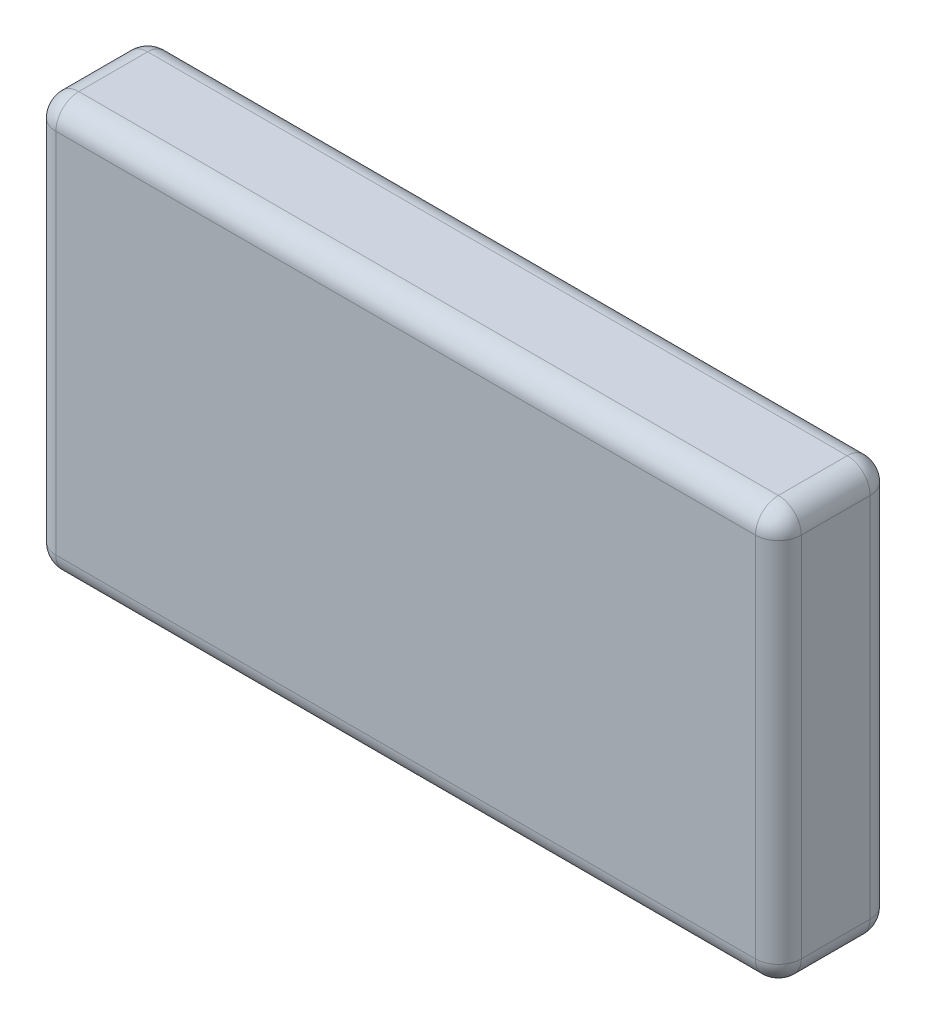
ISO-10303-21;
HEADER;
FILE_DESCRIPTION(('STEP AP214'),'2;1');
FILE_NAME('part.step','',(''),(''),'','','');
FILE_SCHEMA(('AUTOMOTIVE_DESIGN { 1 0 10303 214 1 1 1 1 }'));
ENDSEC;
DATA;
#1=APPLICATION_CONTEXT('core data for automotive mechanical design processes');
#2=APPLICATION_PROTOCOL_DEFINITION('international standard','automotive_design',2000,#1);
#3=PRODUCT_CONTEXT('',#1,'mechanical');
#4=PRODUCT('Part','Part','',(#3));
#5=PRODUCT_RELATED_PRODUCT_CATEGORY('part','',(#4));
#6=PRODUCT_DEFINITION_FORMATION('','',#4);
#7=PRODUCT_DEFINITION_CONTEXT('part definition',#1,'design');
#8=PRODUCT_DEFINITION('design','',#6,#7);
#9=PRODUCT_DEFINITION_SHAPE('','',#8);
#10=(LENGTH_UNIT() NAMED_UNIT(*) SI_UNIT(.MILLI.,.METRE.));
#11=(NAMED_UNIT(*) PLANE_ANGLE_UNIT() SI_UNIT($,.RADIAN.));
#12=(NAMED_UNIT(*) SI_UNIT($,.STERADIAN.) SOLID_ANGLE_UNIT());
#13=UNCERTAINTY_MEASURE_WITH_UNIT(LENGTH_MEASURE(1.E-05),#10,'distance_accuracy_value','');
#14=(GEOMETRIC_REPRESENTATION_CONTEXT(3) GLOBAL_UNCERTAINTY_ASSIGNED_CONTEXT((#13)) GLOBAL_UNIT_ASSIGNED_CONTEXT((#10,
#11,#12)) REPRESENTATION_CONTEXT('',''));
#15=CARTESIAN_POINT('',(0.,0.,0.));
#16=DIRECTION('',(0.,0.,1.));
#17=DIRECTION('',(1.,0.,0.));
#18=AXIS2_PLACEMENT_3D('',#15,#16,#17);
#19=CARTESIAN_POINT('',(0.,0.,10.));
#20=DIRECTION('',(1.,0.,0.));
#21=DIRECTION('',(0.,1.,0.));
#22=AXIS2_PLACEMENT_3D('',#19,#20,#21);
#23=PLANE('',#22);
#24=DIRECTION('',(0.,0.,-1.));
#25=VECTOR('',#24,1.);
#26=CARTESIAN_POINT('',(0.,34.,10.));
#27=LINE('',#26,#25);
#28=CARTESIAN_POINT('',(0.,34.,8.));
#29=VERTEX_POINT('',#28);
#30=CARTESIAN_POINT('',(0.,34.,2.));
#31=VERTEX_POINT('',#30);
#32=EDGE_CURVE('E155',#29,#31,#27,.T.);
#33=ORIENTED_EDGE('',*,*,#32,.T.);
#34=DIRECTION('',(0.,-1.,0.));
#35=VECTOR('',#34,1.);
#36=CARTESIAN_POINT('',(0.,0.,2.));
#37=LINE('',#36,#35);
#38=CARTESIAN_POINT('',(0.,2.,2.));
#39=VERTEX_POINT('',#38);
#40=EDGE_CURVE('E206',#31,#39,#37,.T.);
#41=ORIENTED_EDGE('',*,*,#40,.T.);
#42=DIRECTION('',(0.,0.,-1.));
#43=VECTOR('',#42,1.);
#44=CARTESIAN_POINT('',(0.,2.,10.));
#45=LINE('',#44,#43);
#46=CARTESIAN_POINT('',(0.,2.,8.));
#47=VERTEX_POINT('',#46);
#48=EDGE_CURVE('E201',#39,#47,#45,.F.);
#49=ORIENTED_EDGE('',*,*,#48,.T.);
#50=DIRECTION('',(0.,-1.,0.));
#51=VECTOR('',#50,1.);
#52=CARTESIAN_POINT('',(0.,0.,8.));
#53=LINE('',#52,#51);
#54=EDGE_CURVE('E198',#47,#29,#53,.F.);
#55=ORIENTED_EDGE('',*,*,#54,.T.);
#56=EDGE_LOOP('',(#33,#41,#49,#55));
#57=FACE_BOUND('',#56,.T.);
#58=ADVANCED_FACE('F45',(#57),#23,.F.);
#59=CARTESIAN_POINT('',(0.,0.,10.));
#60=DIRECTION('',(0.,1.,0.));
#61=DIRECTION('',(0.,0.,1.));
#62=AXIS2_PLACEMENT_3D('',#59,#60,#61);
#63=PLANE('',#62);
#64=DIRECTION('',(0.,0.,-1.));
#65=VECTOR('',#64,1.);
#66=CARTESIAN_POINT('',(2.,0.,10.));
#67=LINE('',#66,#65);
#68=CARTESIAN_POINT('',(2.,0.,8.));
#69=VERTEX_POINT('',#68);
#70=CARTESIAN_POINT('',(2.,0.,2.));
#71=VERTEX_POINT('',#70);
#72=EDGE_CURVE('E215',#69,#71,#67,.T.);
#73=ORIENTED_EDGE('',*,*,#72,.T.);
#74=DIRECTION('',(1.,0.,0.));
#75=VECTOR('',#74,1.);
#76=CARTESIAN_POINT('',(65.,0.,2.));
#77=LINE('',#76,#75);
#78=CARTESIAN_POINT('',(63.,0.,2.));
#79=VERTEX_POINT('',#78);
#80=EDGE_CURVE('E219',#71,#79,#77,.T.);
#81=ORIENTED_EDGE('',*,*,#80,.T.);
#82=DIRECTION('',(0.,0.,-1.));
#83=VECTOR('',#82,1.);
#84=CARTESIAN_POINT('',(63.,0.,10.));
#85=LINE('',#84,#83);
#86=CARTESIAN_POINT('',(63.,0.,8.));
#87=VERTEX_POINT('',#86);
#88=EDGE_CURVE('E212',#79,#87,#85,.F.);
#89=ORIENTED_EDGE('',*,*,#88,.T.);
#90=DIRECTION('',(1.,0.,0.));
#91=VECTOR('',#90,1.);
#92=CARTESIAN_POINT('',(0.,0.,8.));
#93=LINE('',#92,#91);
#94=EDGE_CURVE('E209',#87,#69,#93,.F.);
#95=ORIENTED_EDGE('',*,*,#94,.T.);
#96=EDGE_LOOP('',(#73,#81,#89,#95));
#97=FACE_BOUND('',#96,.T.);
#98=ADVANCED_FACE('F353',(#97),#63,.F.);
#99=CARTESIAN_POINT('',(65.,0.,10.));
#100=DIRECTION('',(-1.,0.,0.));
#101=DIRECTION('',(0.,-1.,0.));
#102=AXIS2_PLACEMENT_3D('',#99,#100,#101);
#103=PLANE('',#102);
#104=DIRECTION('',(0.,0.,-1.));
#105=VECTOR('',#104,1.);
#106=CARTESIAN_POINT('',(65.,2.,10.));
#107=LINE('',#106,#105);
#108=CARTESIAN_POINT('',(65.,2.,8.));
#109=VERTEX_POINT('',#108);
#110=CARTESIAN_POINT('',(65.,2.,2.));
#111=VERTEX_POINT('',#110);
#112=EDGE_CURVE('E188',#109,#111,#107,.T.);
#113=ORIENTED_EDGE('',*,*,#112,.T.);
#114=DIRECTION('',(0.,1.,0.));
#115=VECTOR('',#114,1.);
#116=CARTESIAN_POINT('',(65.,36.,2.));
#117=LINE('',#116,#115);
#118=CARTESIAN_POINT('',(65.,34.,2.));
#119=VERTEX_POINT('',#118);
#120=EDGE_CURVE('E195',#111,#119,#117,.T.);
#121=ORIENTED_EDGE('',*,*,#120,.T.);
#122=DIRECTION('',(0.,0.,-1.));
#123=VECTOR('',#122,1.);
#124=CARTESIAN_POINT('',(65.,34.,10.));
#125=LINE('',#124,#123);
#126=CARTESIAN_POINT('',(65.,34.,8.));
#127=VERTEX_POINT('',#126);
#128=EDGE_CURVE('E191',#119,#127,#125,.F.);
#129=ORIENTED_EDGE('',*,*,#128,.T.);
#130=DIRECTION('',(0.,1.,0.));
#131=VECTOR('',#130,1.);
#132=CARTESIAN_POINT('',(65.,0.,8.));
#133=LINE('',#132,#131);
#134=EDGE_CURVE('E185',#127,#109,#133,.F.);
#135=ORIENTED_EDGE('',*,*,#134,.T.);
#136=EDGE_LOOP('',(#113,#121,#129,#135));
#137=FACE_BOUND('',#136,.T.);
#138=ADVANCED_FACE('F344',(#137),#103,.F.);
#139=CARTESIAN_POINT('',(0.,36.,10.));
#140=DIRECTION('',(0.,-1.,0.));
#141=DIRECTION('',(0.,0.,-1.));
#142=AXIS2_PLACEMENT_3D('',#139,#140,#141);
#143=PLANE('',#142);
#144=DIRECTION('',(0.,0.,-1.));
#145=VECTOR('',#144,1.);
#146=CARTESIAN_POINT('',(63.,36.,10.));
#147=LINE('',#146,#145);
#148=CARTESIAN_POINT('',(63.,36.,8.));
#149=VERTEX_POINT('',#148);
#150=CARTESIAN_POINT('',(63.,36.,2.));
#151=VERTEX_POINT('',#150);
#152=EDGE_CURVE('E147',#149,#151,#147,.T.);
#153=ORIENTED_EDGE('',*,*,#152,.T.);
#154=DIRECTION('',(-1.,0.,0.));
#155=VECTOR('',#154,1.);
#156=CARTESIAN_POINT('',(0.,36.,2.));
#157=LINE('',#156,#155);
#158=CARTESIAN_POINT('',(1.99999999999999,36.,2.));
#159=VERTEX_POINT('',#158);
#160=EDGE_CURVE('E142',#151,#159,#157,.T.);
#161=ORIENTED_EDGE('',*,*,#160,.T.);
#162=DIRECTION('',(0.,0.,-1.));
#163=VECTOR('',#162,1.);
#164=CARTESIAN_POINT('',(1.99999999999999,36.,10.));
#165=LINE('',#164,#163);
#166=CARTESIAN_POINT('',(1.99999999999999,36.,8.));
#167=VERTEX_POINT('',#166);
#168=EDGE_CURVE('E134',#159,#167,#165,.F.);
#169=ORIENTED_EDGE('',*,*,#168,.T.);
#170=DIRECTION('',(-1.,0.,0.));
#171=VECTOR('',#170,1.);
#172=CARTESIAN_POINT('',(0.,36.,8.));
#173=LINE('',#172,#171);
#174=EDGE_CURVE('E139',#167,#149,#173,.F.);
#175=ORIENTED_EDGE('',*,*,#174,.T.);
#176=EDGE_LOOP('',(#153,#161,#169,#175));
#177=FACE_BOUND('',#176,.T.);
#178=ADVANCED_FACE('F137',(#177),#143,.F.);
#179=CARTESIAN_POINT('',(0.,0.,10.));
#180=DIRECTION('',(0.,0.,-1.));
#181=DIRECTION('',(-1.,0.,0.));
#182=AXIS2_PLACEMENT_3D('',#179,#180,#181);
#183=PLANE('',#182);
#184=DIRECTION('',(0.,1.,0.));
#185=VECTOR('',#184,1.);
#186=CARTESIAN_POINT('',(63.,0.,10.));
#187=LINE('',#186,#185);
#188=CARTESIAN_POINT('',(63.,2.,10.));
#189=VERTEX_POINT('',#188);
#190=CARTESIAN_POINT('',(63.,34.,10.));
#191=VERTEX_POINT('',#190);
#192=EDGE_CURVE('E55',#189,#191,#187,.T.);
#193=ORIENTED_EDGE('',*,*,#192,.T.);
#194=DIRECTION('',(-1.,0.,0.));
#195=VECTOR('',#194,1.);
#196=CARTESIAN_POINT('',(0.,34.,10.));
#197=LINE('',#196,#195);
#198=CARTESIAN_POINT('',(1.99999999999999,34.,10.));
#199=VERTEX_POINT('',#198);
#200=EDGE_CURVE('E11',#191,#199,#197,.T.);
#201=ORIENTED_EDGE('',*,*,#200,.T.);
#202=DIRECTION('',(0.,-1.,0.));
#203=VECTOR('',#202,1.);
#204=CARTESIAN_POINT('',(2.,0.,10.));
#205=LINE('',#204,#203);
#206=CARTESIAN_POINT('',(2.,2.,10.));
#207=VERTEX_POINT('',#206);
#208=EDGE_CURVE('E235',#199,#207,#205,.T.);
#209=ORIENTED_EDGE('',*,*,#208,.T.);
#210=DIRECTION('',(1.,0.,0.));
#211=VECTOR('',#210,1.);
#212=CARTESIAN_POINT('',(0.,2.,10.));
#213=LINE('',#212,#211);
#214=EDGE_CURVE('E66',#207,#189,#213,.T.);
#215=ORIENTED_EDGE('',*,*,#214,.T.);
#216=EDGE_LOOP('',(#193,#201,#209,#215));
#217=FACE_BOUND('',#216,.T.);
#218=ADVANCED_FACE('F366',(#217),#183,.F.);
#219=CARTESIAN_POINT('',(0.,0.,0.));
#220=DIRECTION('',(0.,0.,-1.));
#221=DIRECTION('',(-1.,0.,0.));
#222=AXIS2_PLACEMENT_3D('',#219,#220,#221);
#223=PLANE('',#222);
#224=DIRECTION('',(0.,1.,0.));
#225=VECTOR('',#224,1.);
#226=CARTESIAN_POINT('',(63.,0.,0.));
#227=LINE('',#226,#225);
#228=CARTESIAN_POINT('',(63.,34.,0.));
#229=VERTEX_POINT('',#228);
#230=CARTESIAN_POINT('',(63.,2.,0.));
#231=VERTEX_POINT('',#230);
#232=EDGE_CURVE('E228',#229,#231,#227,.F.);
#233=ORIENTED_EDGE('',*,*,#232,.T.);
#234=DIRECTION('',(1.,0.,0.));
#235=VECTOR('',#234,1.);
#236=CARTESIAN_POINT('',(0.,2.,0.));
#237=LINE('',#236,#235);
#238=CARTESIAN_POINT('',(2.,2.,0.));
#239=VERTEX_POINT('',#238);
#240=EDGE_CURVE('E231',#231,#239,#237,.F.);
#241=ORIENTED_EDGE('',*,*,#240,.T.);
#242=DIRECTION('',(0.,-1.,0.));
#243=VECTOR('',#242,1.);
#244=CARTESIAN_POINT('',(1.99999999999999,36.,0.));
#245=LINE('',#244,#243);
#246=CARTESIAN_POINT('',(1.99999999999999,34.,0.));
#247=VERTEX_POINT('',#246);
#248=EDGE_CURVE('E222',#239,#247,#245,.F.);
#249=ORIENTED_EDGE('',*,*,#248,.T.);
#250=DIRECTION('',(-1.,0.,0.));
#251=VECTOR('',#250,1.);
#252=CARTESIAN_POINT('',(65.,34.,0.));
#253=LINE('',#252,#251);
#254=EDGE_CURVE('E225',#247,#229,#253,.F.);
#255=ORIENTED_EDGE('',*,*,#254,.T.);
#256=EDGE_LOOP('',(#233,#241,#249,#255));
#257=FACE_BOUND('',#256,.T.);
#258=ADVANCED_FACE('F326',(#257),#223,.T.);
#259=CARTESIAN_POINT('',(2.,2.,10.));
#260=DIRECTION('',(0.,0.,-1.));
#261=DIRECTION('',(-1.,0.,0.));
#262=AXIS2_PLACEMENT_3D('',#259,#260,#261);
#263=CYLINDRICAL_SURFACE('',#262,2.);
#264=CARTESIAN_POINT('',(2.,2.,8.));
#265=DIRECTION('',(0.,0.,1.));
#266=DIRECTION('',(1.,0.,0.));
#267=AXIS2_PLACEMENT_3D('',#264,#265,#266);
#268=CIRCLE('',#267,2.);
#269=EDGE_CURVE('E49',#47,#69,#268,.T.);
#270=ORIENTED_EDGE('',*,*,#269,.F.);
#271=ORIENTED_EDGE('',*,*,#48,.F.);
#272=CARTESIAN_POINT('',(2.,2.,2.));
#273=DIRECTION('',(0.,0.,-1.));
#274=DIRECTION('',(-1.,0.,0.));
#275=AXIS2_PLACEMENT_3D('',#272,#273,#274);
#276=CIRCLE('',#275,2.);
#277=EDGE_CURVE('E179',#71,#39,#276,.T.);
#278=ORIENTED_EDGE('',*,*,#277,.F.);
#279=ORIENTED_EDGE('',*,*,#72,.F.);
#280=EDGE_LOOP('',(#270,#271,#278,#279));
#281=FACE_BOUND('',#280,.T.);
#282=ADVANCED_FACE('F47',(#281),#263,.T.);
#283=CARTESIAN_POINT('',(2.,2.,8.));
#284=DIRECTION('',(0.,-1.,0.));
#285=DIRECTION('',(0.,0.,-1.));
#286=AXIS2_PLACEMENT_3D('',#283,#284,#285);
#287=SPHERICAL_SURFACE('',#286,2.);
#288=CARTESIAN_POINT('',(2.,2.,8.));
#289=DIRECTION('',(0.,-1.,0.));
#290=DIRECTION('',(1.,0.,0.));
#291=AXIS2_PLACEMENT_3D('',#288,#289,#290);
#292=CIRCLE('',#291,2.);
#293=EDGE_CURVE('E303',#47,#207,#292,.F.);
#294=ORIENTED_EDGE('',*,*,#293,.F.);
#295=ORIENTED_EDGE('',*,*,#269,.T.);
#296=CARTESIAN_POINT('',(2.,2.,8.));
#297=DIRECTION('',(-1.,0.,0.));
#298=DIRECTION('',(0.,0.,1.));
#299=AXIS2_PLACEMENT_3D('',#296,#297,#298);
#300=CIRCLE('',#299,2.);
#301=EDGE_CURVE('E307',#207,#69,#300,.F.);
#302=ORIENTED_EDGE('',*,*,#301,.F.);
#303=EDGE_LOOP('',(#294,#295,#302));
#304=FACE_BOUND('',#303,.T.);
#305=ADVANCED_FACE('F360',(#304),#287,.T.);
#306=CARTESIAN_POINT('',(2.,2.,2.));
#307=DIRECTION('',(-1.,0.,0.));
#308=DIRECTION('',(0.,-1.,0.));
#309=AXIS2_PLACEMENT_3D('',#306,#307,#308);
#310=SPHERICAL_SURFACE('',#309,2.);
#311=CARTESIAN_POINT('',(2.,2.,2.));
#312=DIRECTION('',(-1.,0.,0.));
#313=DIRECTION('',(0.,0.,1.));
#314=AXIS2_PLACEMENT_3D('',#311,#312,#313);
#315=CIRCLE('',#314,2.);
#316=EDGE_CURVE('E295',#71,#239,#315,.F.);
#317=ORIENTED_EDGE('',*,*,#316,.F.);
#318=ORIENTED_EDGE('',*,*,#277,.T.);
#319=CARTESIAN_POINT('',(2.,2.,2.));
#320=DIRECTION('',(0.,-1.,0.));
#321=DIRECTION('',(1.,0.,0.));
#322=AXIS2_PLACEMENT_3D('',#319,#320,#321);
#323=CIRCLE('',#322,2.);
#324=EDGE_CURVE('E299',#239,#39,#323,.F.);
#325=ORIENTED_EDGE('',*,*,#324,.F.);
#326=EDGE_LOOP('',(#317,#318,#325));
#327=FACE_BOUND('',#326,.T.);
#328=ADVANCED_FACE('F316',(#327),#310,.T.);
#329=CARTESIAN_POINT('',(0.,2.,8.));
#330=DIRECTION('',(1.,0.,0.));
#331=DIRECTION('',(0.,0.,-1.));
#332=AXIS2_PLACEMENT_3D('',#329,#330,#331);
#333=CYLINDRICAL_SURFACE('',#332,2.);
#334=ORIENTED_EDGE('',*,*,#301,.T.);
#335=ORIENTED_EDGE('',*,*,#94,.F.);
#336=CARTESIAN_POINT('',(63.,2.,8.));
#337=DIRECTION('',(1.,0.,0.));
#338=DIRECTION('',(0.,0.,-1.));
#339=AXIS2_PLACEMENT_3D('',#336,#337,#338);
#340=CIRCLE('',#339,2.);
#341=EDGE_CURVE('E287',#189,#87,#340,.T.);
#342=ORIENTED_EDGE('',*,*,#341,.F.);
#343=ORIENTED_EDGE('',*,*,#214,.F.);
#344=EDGE_LOOP('',(#334,#335,#342,#343));
#345=FACE_BOUND('',#344,.T.);
#346=ADVANCED_FACE('F355',(#345),#333,.T.);
#347=CARTESIAN_POINT('',(2.,0.,8.));
#348=DIRECTION('',(0.,-1.,0.));
#349=DIRECTION('',(1.,0.,0.));
#350=AXIS2_PLACEMENT_3D('',#347,#348,#349);
#351=CYLINDRICAL_SURFACE('',#350,2.);
#352=ORIENTED_EDGE('',*,*,#293,.T.);
#353=ORIENTED_EDGE('',*,*,#208,.F.);
#354=CARTESIAN_POINT('',(1.99999999999999,34.,8.));
#355=DIRECTION('',(0.,1.,0.));
#356=DIRECTION('',(0.,0.,1.));
#357=AXIS2_PLACEMENT_3D('',#354,#355,#356);
#358=CIRCLE('',#357,2.);
#359=EDGE_CURVE('E160',#29,#199,#358,.T.);
#360=ORIENTED_EDGE('',*,*,#359,.F.);
#361=ORIENTED_EDGE('',*,*,#54,.F.);
#362=EDGE_LOOP('',(#352,#353,#360,#361));
#363=FACE_BOUND('',#362,.T.);
#364=ADVANCED_FACE('F365',(#363),#351,.T.);
#365=CARTESIAN_POINT('',(1.99999999999999,34.,10.));
#366=DIRECTION('',(0.,0.,-1.));
#367=DIRECTION('',(-1.,0.,0.));
#368=AXIS2_PLACEMENT_3D('',#365,#366,#367);
#369=CYLINDRICAL_SURFACE('',#368,2.);
#370=CARTESIAN_POINT('',(1.99999999999999,34.,2.));
#371=DIRECTION('',(0.,0.,-1.));
#372=DIRECTION('',(-1.,0.,0.));
#373=AXIS2_PLACEMENT_3D('',#370,#371,#372);
#374=CIRCLE('',#373,2.);
#375=EDGE_CURVE('E161',#31,#159,#374,.T.);
#376=ORIENTED_EDGE('',*,*,#375,.F.);
#377=ORIENTED_EDGE('',*,*,#32,.F.);
#378=CARTESIAN_POINT('',(1.99999999999999,34.,8.));
#379=DIRECTION('',(0.,0.,1.));
#380=DIRECTION('',(1.,0.,0.));
#381=AXIS2_PLACEMENT_3D('',#378,#379,#380);
#382=CIRCLE('',#381,2.);
#383=EDGE_CURVE('E151',#167,#29,#382,.T.);
#384=ORIENTED_EDGE('',*,*,#383,.F.);
#385=ORIENTED_EDGE('',*,*,#168,.F.);
#386=EDGE_LOOP('',(#376,#377,#384,#385));
#387=FACE_BOUND('',#386,.T.);
#388=ADVANCED_FACE('F153',(#387),#369,.T.);
#389=CARTESIAN_POINT('',(2.,0.,2.));
#390=DIRECTION('',(0.,1.,0.));
#391=DIRECTION('',(-1.,0.,0.));
#392=AXIS2_PLACEMENT_3D('',#389,#390,#391);
#393=CYLINDRICAL_SURFACE('',#392,2.);
#394=ORIENTED_EDGE('',*,*,#324,.T.);
#395=ORIENTED_EDGE('',*,*,#40,.F.);
#396=CARTESIAN_POINT('',(1.99999999999999,34.,2.));
#397=DIRECTION('',(0.,1.,0.));
#398=DIRECTION('',(0.,0.,1.));
#399=AXIS2_PLACEMENT_3D('',#396,#397,#398);
#400=CIRCLE('',#399,2.);
#401=EDGE_CURVE('E280',#247,#31,#400,.T.);
#402=ORIENTED_EDGE('',*,*,#401,.F.);
#403=ORIENTED_EDGE('',*,*,#248,.F.);
#404=EDGE_LOOP('',(#394,#395,#402,#403));
#405=FACE_BOUND('',#404,.T.);
#406=ADVANCED_FACE('F322',(#405),#393,.T.);
#407=CARTESIAN_POINT('',(0.,2.,2.));
#408=DIRECTION('',(-1.,0.,0.));
#409=DIRECTION('',(0.,0.,1.));
#410=AXIS2_PLACEMENT_3D('',#407,#408,#409);
#411=CYLINDRICAL_SURFACE('',#410,2.);
#412=ORIENTED_EDGE('',*,*,#316,.T.);
#413=ORIENTED_EDGE('',*,*,#240,.F.);
#414=CARTESIAN_POINT('',(63.,2.,2.));
#415=DIRECTION('',(1.,0.,0.));
#416=DIRECTION('',(0.,0.,-1.));
#417=AXIS2_PLACEMENT_3D('',#414,#415,#416);
#418=CIRCLE('',#417,2.);
#419=EDGE_CURVE('E276',#79,#231,#418,.T.);
#420=ORIENTED_EDGE('',*,*,#419,.F.);
#421=ORIENTED_EDGE('',*,*,#80,.F.);
#422=EDGE_LOOP('',(#412,#413,#420,#421));
#423=FACE_BOUND('',#422,.T.);
#424=ADVANCED_FACE('F332',(#423),#411,.T.);
#425=CARTESIAN_POINT('',(63.,2.,10.));
#426=DIRECTION('',(0.,0.,-1.));
#427=DIRECTION('',(-1.,0.,0.));
#428=AXIS2_PLACEMENT_3D('',#425,#426,#427);
#429=CYLINDRICAL_SURFACE('',#428,2.);
#430=CARTESIAN_POINT('',(63.,2.,8.));
#431=DIRECTION('',(0.,0.,1.));
#432=DIRECTION('',(1.,0.,0.));
#433=AXIS2_PLACEMENT_3D('',#430,#431,#432);
#434=CIRCLE('',#433,2.);
#435=EDGE_CURVE('E291',#87,#109,#434,.T.);
#436=ORIENTED_EDGE('',*,*,#435,.F.);
#437=ORIENTED_EDGE('',*,*,#88,.F.);
#438=CARTESIAN_POINT('',(63.,2.,2.));
#439=DIRECTION('',(0.,0.,-1.));
#440=DIRECTION('',(-1.,0.,0.));
#441=AXIS2_PLACEMENT_3D('',#438,#439,#440);
#442=CIRCLE('',#441,2.);
#443=EDGE_CURVE('E272',#111,#79,#442,.T.);
#444=ORIENTED_EDGE('',*,*,#443,.F.);
#445=ORIENTED_EDGE('',*,*,#112,.F.);
#446=EDGE_LOOP('',(#436,#437,#444,#445));
#447=FACE_BOUND('',#446,.T.);
#448=ADVANCED_FACE('F350',(#447),#429,.T.);
#449=CARTESIAN_POINT('',(63.,2.,8.));
#450=DIRECTION('',(0.,-1.,0.));
#451=DIRECTION('',(0.,0.,-1.));
#452=AXIS2_PLACEMENT_3D('',#449,#450,#451);
#453=SPHERICAL_SURFACE('',#452,2.);
#454=ORIENTED_EDGE('',*,*,#341,.T.);
#455=ORIENTED_EDGE('',*,*,#435,.T.);
#456=CARTESIAN_POINT('',(63.,2.,8.));
#457=DIRECTION('',(0.,-1.,0.));
#458=DIRECTION('',(1.,0.,0.));
#459=AXIS2_PLACEMENT_3D('',#456,#457,#458);
#460=CIRCLE('',#459,2.);
#461=EDGE_CURVE('E168',#189,#109,#460,.F.);
#462=ORIENTED_EDGE('',*,*,#461,.F.);
#463=EDGE_LOOP('',(#454,#455,#462));
#464=FACE_BOUND('',#463,.T.);
#465=ADVANCED_FACE('F389',(#464),#453,.T.);
#466=CARTESIAN_POINT('',(1.99999999999999,34.,8.));
#467=DIRECTION('',(-1.,0.,0.));
#468=DIRECTION('',(0.,0.,1.));
#469=AXIS2_PLACEMENT_3D('',#466,#467,#468);
#470=SPHERICAL_SURFACE('',#469,2.);
#471=ORIENTED_EDGE('',*,*,#383,.T.);
#472=ORIENTED_EDGE('',*,*,#359,.T.);
#473=CARTESIAN_POINT('',(1.99999999999999,34.,8.));
#474=DIRECTION('',(-1.,0.,0.));
#475=DIRECTION('',(0.,0.,1.));
#476=AXIS2_PLACEMENT_3D('',#473,#474,#475);
#477=CIRCLE('',#476,2.);
#478=EDGE_CURVE('E163',#167,#199,#477,.F.);
#479=ORIENTED_EDGE('',*,*,#478,.F.);
#480=EDGE_LOOP('',(#471,#472,#479));
#481=FACE_BOUND('',#480,.T.);
#482=ADVANCED_FACE('F164',(#481),#470,.T.);
#483=CARTESIAN_POINT('',(1.99999999999999,34.,2.));
#484=DIRECTION('',(-1.,0.,0.));
#485=DIRECTION('',(0.,0.,1.));
#486=AXIS2_PLACEMENT_3D('',#483,#484,#485);
#487=SPHERICAL_SURFACE('',#486,2.);
#488=ORIENTED_EDGE('',*,*,#401,.T.);
#489=ORIENTED_EDGE('',*,*,#375,.T.);
#490=CARTESIAN_POINT('',(1.99999999999999,34.,2.));
#491=DIRECTION('',(-1.,0.,0.));
#492=DIRECTION('',(0.,0.,1.));
#493=AXIS2_PLACEMENT_3D('',#490,#491,#492);
#494=CIRCLE('',#493,2.);
#495=EDGE_CURVE('E169',#247,#159,#494,.F.);
#496=ORIENTED_EDGE('',*,*,#495,.F.);
#497=EDGE_LOOP('',(#488,#489,#496));
#498=FACE_BOUND('',#497,.T.);
#499=ADVANCED_FACE('F381',(#498),#487,.T.);
#500=CARTESIAN_POINT('',(63.,2.,2.));
#501=DIRECTION('',(0.,-1.,0.));
#502=DIRECTION('',(0.,0.,-1.));
#503=AXIS2_PLACEMENT_3D('',#500,#501,#502);
#504=SPHERICAL_SURFACE('',#503,2.);
#505=ORIENTED_EDGE('',*,*,#443,.T.);
#506=ORIENTED_EDGE('',*,*,#419,.T.);
#507=CARTESIAN_POINT('',(63.,2.,2.));
#508=DIRECTION('',(0.,-1.,0.));
#509=DIRECTION('',(1.,0.,0.));
#510=AXIS2_PLACEMENT_3D('',#507,#508,#509);
#511=CIRCLE('',#510,2.);
#512=EDGE_CURVE('E262',#111,#231,#511,.F.);
#513=ORIENTED_EDGE('',*,*,#512,.F.);
#514=EDGE_LOOP('',(#505,#506,#513));
#515=FACE_BOUND('',#514,.T.);
#516=ADVANCED_FACE('F335',(#515),#504,.T.);
#517=CARTESIAN_POINT('',(63.,0.,8.));
#518=DIRECTION('',(0.,1.,0.));
#519=DIRECTION('',(-1.,0.,0.));
#520=AXIS2_PLACEMENT_3D('',#517,#518,#519);
#521=CYLINDRICAL_SURFACE('',#520,2.);
#522=ORIENTED_EDGE('',*,*,#461,.T.);
#523=ORIENTED_EDGE('',*,*,#134,.F.);
#524=CARTESIAN_POINT('',(63.,34.,8.));
#525=DIRECTION('',(0.,1.,0.));
#526=DIRECTION('',(0.,0.,1.));
#527=AXIS2_PLACEMENT_3D('',#524,#525,#526);
#528=CIRCLE('',#527,2.);
#529=EDGE_CURVE('E258',#191,#127,#528,.T.);
#530=ORIENTED_EDGE('',*,*,#529,.F.);
#531=ORIENTED_EDGE('',*,*,#192,.F.);
#532=EDGE_LOOP('',(#522,#523,#530,#531));
#533=FACE_BOUND('',#532,.T.);
#534=ADVANCED_FACE('F369',(#533),#521,.T.);
#535=CARTESIAN_POINT('',(0.,34.,8.));
#536=DIRECTION('',(-1.,0.,0.));
#537=DIRECTION('',(0.,0.,1.));
#538=AXIS2_PLACEMENT_3D('',#535,#536,#537);
#539=CYLINDRICAL_SURFACE('',#538,2.);
#540=ORIENTED_EDGE('',*,*,#478,.T.);
#541=ORIENTED_EDGE('',*,*,#200,.F.);
#542=CARTESIAN_POINT('',(63.,34.,8.));
#543=DIRECTION('',(1.,0.,0.));
#544=DIRECTION('',(0.,0.,-1.));
#545=AXIS2_PLACEMENT_3D('',#542,#543,#544);
#546=CIRCLE('',#545,2.);
#547=EDGE_CURVE('E173',#149,#191,#546,.T.);
#548=ORIENTED_EDGE('',*,*,#547,.F.);
#549=ORIENTED_EDGE('',*,*,#174,.F.);
#550=EDGE_LOOP('',(#540,#541,#548,#549));
#551=FACE_BOUND('',#550,.T.);
#552=ADVANCED_FACE('F171',(#551),#539,.T.);
#553=CARTESIAN_POINT('',(0.,34.,2.));
#554=DIRECTION('',(1.,0.,0.));
#555=DIRECTION('',(0.,0.,-1.));
#556=AXIS2_PLACEMENT_3D('',#553,#554,#555);
#557=CYLINDRICAL_SURFACE('',#556,2.);
#558=ORIENTED_EDGE('',*,*,#495,.T.);
#559=ORIENTED_EDGE('',*,*,#160,.F.);
#560=CARTESIAN_POINT('',(63.,34.,2.));
#561=DIRECTION('',(1.,0.,0.));
#562=DIRECTION('',(0.,0.,-1.));
#563=AXIS2_PLACEMENT_3D('',#560,#561,#562);
#564=CIRCLE('',#563,2.);
#565=EDGE_CURVE('E252',#229,#151,#564,.T.);
#566=ORIENTED_EDGE('',*,*,#565,.F.);
#567=ORIENTED_EDGE('',*,*,#254,.F.);
#568=EDGE_LOOP('',(#558,#559,#566,#567));
#569=FACE_BOUND('',#568,.T.);
#570=ADVANCED_FACE('F379',(#569),#557,.T.);
#571=CARTESIAN_POINT('',(63.,0.,2.));
#572=DIRECTION('',(0.,-1.,0.));
#573=DIRECTION('',(1.,0.,0.));
#574=AXIS2_PLACEMENT_3D('',#571,#572,#573);
#575=CYLINDRICAL_SURFACE('',#574,2.);
#576=ORIENTED_EDGE('',*,*,#512,.T.);
#577=ORIENTED_EDGE('',*,*,#232,.F.);
#578=CARTESIAN_POINT('',(63.,34.,2.));
#579=DIRECTION('',(0.,1.,0.));
#580=DIRECTION('',(0.,0.,1.));
#581=AXIS2_PLACEMENT_3D('',#578,#579,#580);
#582=CIRCLE('',#581,2.);
#583=EDGE_CURVE('E248',#119,#229,#582,.T.);
#584=ORIENTED_EDGE('',*,*,#583,.F.);
#585=ORIENTED_EDGE('',*,*,#120,.F.);
#586=EDGE_LOOP('',(#576,#577,#584,#585));
#587=FACE_BOUND('',#586,.T.);
#588=ADVANCED_FACE('F339',(#587),#575,.T.);
#589=CARTESIAN_POINT('',(63.,34.,8.));
#590=DIRECTION('',(0.,0.,1.));
#591=DIRECTION('',(1.,0.,0.));
#592=AXIS2_PLACEMENT_3D('',#589,#590,#591);
#593=SPHERICAL_SURFACE('',#592,2.);
#594=ORIENTED_EDGE('',*,*,#547,.T.);
#595=ORIENTED_EDGE('',*,*,#529,.T.);
#596=CARTESIAN_POINT('',(63.,34.,8.));
#597=DIRECTION('',(0.,0.,1.));
#598=DIRECTION('',(1.,0.,0.));
#599=AXIS2_PLACEMENT_3D('',#596,#597,#598);
#600=CIRCLE('',#599,2.);
#601=EDGE_CURVE('E245',#149,#127,#600,.F.);
#602=ORIENTED_EDGE('',*,*,#601,.F.);
#603=EDGE_LOOP('',(#594,#595,#602));
#604=FACE_BOUND('',#603,.T.);
#605=ADVANCED_FACE('F371',(#604),#593,.T.);
#606=CARTESIAN_POINT('',(63.,34.,2.));
#607=DIRECTION('',(0.,0.,-1.));
#608=DIRECTION('',(-1.,0.,0.));
#609=AXIS2_PLACEMENT_3D('',#606,#607,#608);
#610=SPHERICAL_SURFACE('',#609,2.);
#611=ORIENTED_EDGE('',*,*,#583,.T.);
#612=ORIENTED_EDGE('',*,*,#565,.T.);
#613=CARTESIAN_POINT('',(63.,34.,2.));
#614=DIRECTION('',(0.,0.,-1.));
#615=DIRECTION('',(-1.,0.,0.));
#616=AXIS2_PLACEMENT_3D('',#613,#614,#615);
#617=CIRCLE('',#616,2.);
#618=EDGE_CURVE('E242',#119,#151,#617,.F.);
#619=ORIENTED_EDGE('',*,*,#618,.F.);
#620=EDGE_LOOP('',(#611,#612,#619));
#621=FACE_BOUND('',#620,.T.);
#622=ADVANCED_FACE('F377',(#621),#610,.T.);
#623=CARTESIAN_POINT('',(63.,34.,10.));
#624=DIRECTION('',(0.,0.,-1.));
#625=DIRECTION('',(-1.,0.,0.));
#626=AXIS2_PLACEMENT_3D('',#623,#624,#625);
#627=CYLINDRICAL_SURFACE('',#626,2.);
#628=ORIENTED_EDGE('',*,*,#601,.T.);
#629=ORIENTED_EDGE('',*,*,#128,.F.);
#630=ORIENTED_EDGE('',*,*,#618,.T.);
#631=ORIENTED_EDGE('',*,*,#152,.F.);
#632=EDGE_LOOP('',(#628,#629,#630,#631));
#633=FACE_BOUND('',#632,.T.);
#634=ADVANCED_FACE('F374',(#633),#627,.T.);
#635=CLOSED_SHELL('',(#58,#98,#138,#178,#218,#258,#282,#305,#328,#346,#364,#388,#406,#424,#448,
#465,#482,#499,#516,#534,#552,#570,#588,#605,#622,#634));
#636=MANIFOLD_SOLID_BREP('B2',#635);
#637=ADVANCED_BREP_SHAPE_REPRESENTATION('',(#18,#636),#14);
#638=SHAPE_DEFINITION_REPRESENTATION(#9,#637);
ENDSEC;
END-ISO-10303-21;
